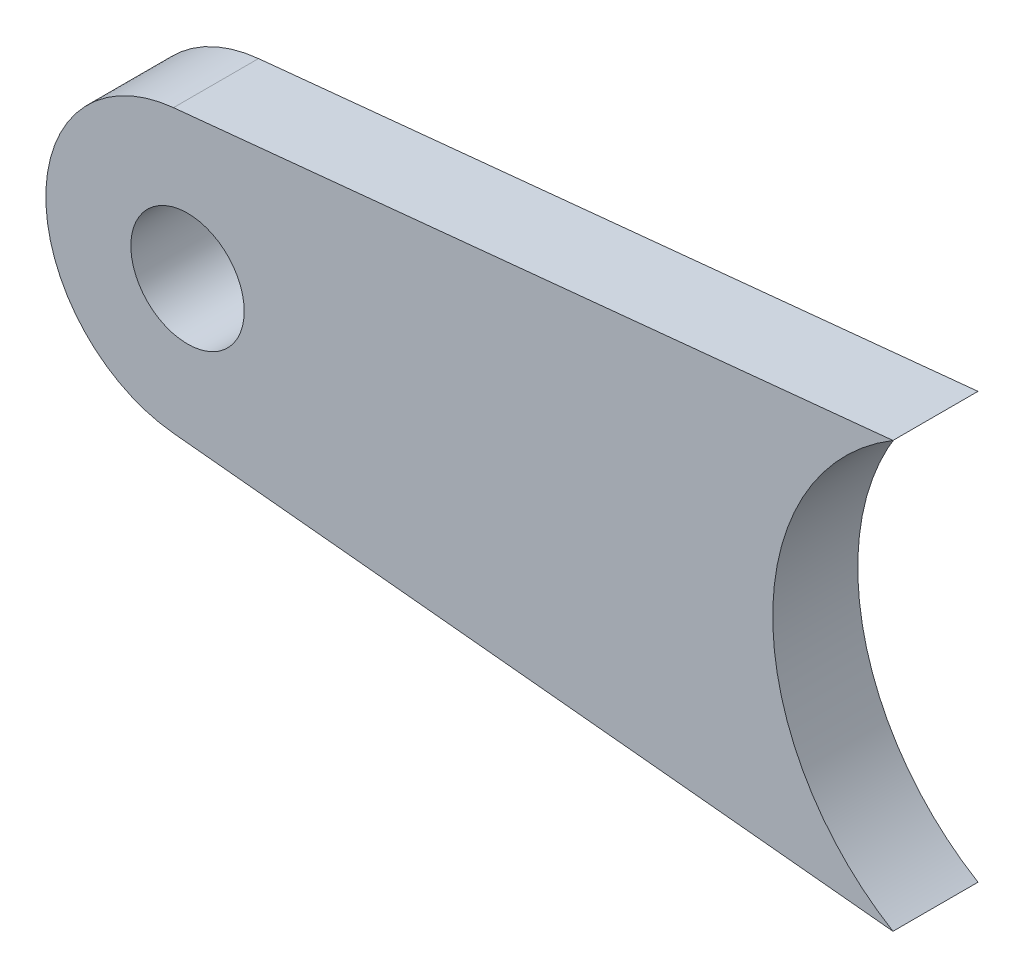
ISO-10303-21;
HEADER;
FILE_DESCRIPTION(('STEP AP214'),'2;1');
FILE_NAME('part.step','',(''),(''),'','','');
FILE_SCHEMA(('AUTOMOTIVE_DESIGN { 1 0 10303 214 1 1 1 1 }'));
ENDSEC;
DATA;
#1=APPLICATION_CONTEXT('core data for automotive mechanical design processes');
#2=APPLICATION_PROTOCOL_DEFINITION('international standard','automotive_design',2000,#1);
#3=PRODUCT_CONTEXT('',#1,'mechanical');
#4=PRODUCT('Part','Part','',(#3));
#5=PRODUCT_RELATED_PRODUCT_CATEGORY('part','',(#4));
#6=PRODUCT_DEFINITION_FORMATION('','',#4);
#7=PRODUCT_DEFINITION_CONTEXT('part definition',#1,'design');
#8=PRODUCT_DEFINITION('design','',#6,#7);
#9=PRODUCT_DEFINITION_SHAPE('','',#8);
#10=(LENGTH_UNIT() NAMED_UNIT(*) SI_UNIT(.MILLI.,.METRE.));
#11=(NAMED_UNIT(*) PLANE_ANGLE_UNIT() SI_UNIT($,.RADIAN.));
#12=(NAMED_UNIT(*) SI_UNIT($,.STERADIAN.) SOLID_ANGLE_UNIT());
#13=UNCERTAINTY_MEASURE_WITH_UNIT(LENGTH_MEASURE(1.E-05),#10,'distance_accuracy_value','');
#14=(GEOMETRIC_REPRESENTATION_CONTEXT(3) GLOBAL_UNCERTAINTY_ASSIGNED_CONTEXT((#13)) GLOBAL_UNIT_ASSIGNED_CONTEXT((#10,
#11,#12)) REPRESENTATION_CONTEXT('',''));
#15=CARTESIAN_POINT('',(0.,0.,0.));
#16=DIRECTION('',(0.,0.,1.));
#17=DIRECTION('',(1.,0.,0.));
#18=AXIS2_PLACEMENT_3D('',#15,#16,#17);
#19=CARTESIAN_POINT('',(77.815,0.,6.));
#20=DIRECTION('',(0.,0.,1.));
#21=DIRECTION('',(1.,0.,0.));
#22=AXIS2_PLACEMENT_3D('',#19,#20,#21);
#23=PLANE('',#22);
#24=CARTESIAN_POINT('',(77.815,0.,6.));
#25=DIRECTION('',(0.,0.,-1.));
#26=DIRECTION('',(1.,0.,0.));
#27=AXIS2_PLACEMENT_3D('',#24,#25,#26);
#28=CIRCLE('',#27,35.);
#29=CARTESIAN_POINT('',(59.78724362268,-30.,6.));
#30=VERTEX_POINT('',#29);
#31=CARTESIAN_POINT('',(59.78724362268,30.,6.));
#32=VERTEX_POINT('',#31);
#33=EDGE_CURVE('E87',#30,#32,#28,.T.);
#34=ORIENTED_EDGE('',*,*,#33,.T.);
#35=DIRECTION('',(-0.995092310823552,-0.0989509622987177,0.));
#36=VECTOR('',#35,1.);
#37=CARTESIAN_POINT('',(59.78724362268,30.,6.));
#38=LINE('',#37,#36);
#39=CARTESIAN_POINT('',(-41.7640192459744,19.9018462164711,6.));
#40=VERTEX_POINT('',#39);
#41=EDGE_CURVE('E82',#32,#40,#38,.T.);
#42=ORIENTED_EDGE('',*,*,#41,.T.);
#43=CARTESIAN_POINT('',(-39.785,0.,6.));
#44=DIRECTION('',(0.,0.,1.));
#45=DIRECTION('',(1.,0.,0.));
#46=AXIS2_PLACEMENT_3D('',#43,#44,#45);
#47=CIRCLE('',#46,20.);
#48=CARTESIAN_POINT('',(-41.7640192459744,-19.9018462164711,6.));
#49=VERTEX_POINT('',#48);
#50=EDGE_CURVE('E85',#40,#49,#47,.T.);
#51=ORIENTED_EDGE('',*,*,#50,.T.);
#52=DIRECTION('',(0.995092310823552,-0.0989509622987182,0.));
#53=VECTOR('',#52,1.);
#54=CARTESIAN_POINT('',(-41.7640192459744,-19.9018462164711,6.));
#55=LINE('',#54,#53);
#56=EDGE_CURVE('E52',#49,#30,#55,.T.);
#57=ORIENTED_EDGE('',*,*,#56,.T.);
#58=EDGE_LOOP('',(#34,#42,#51,#57));
#59=FACE_BOUND('',#58,.T.);
#60=CARTESIAN_POINT('',(-39.785,0.,6.));
#61=DIRECTION('',(0.,0.,1.));
#62=DIRECTION('',(1.,0.,0.));
#63=AXIS2_PLACEMENT_3D('',#60,#61,#62);
#64=CIRCLE('',#63,8.);
#65=CARTESIAN_POINT('',(-31.785,0.,6.));
#66=VERTEX_POINT('',#65);
#67=EDGE_CURVE('E102',#66,#66,#64,.T.);
#68=ORIENTED_EDGE('',*,*,#67,.F.);
#69=EDGE_LOOP('',(#68));
#70=FACE_BOUND('',#69,.T.);
#71=ADVANCED_FACE('F35',(#59,#70),#23,.T.);
#72=CARTESIAN_POINT('',(77.815,0.,-6.));
#73=DIRECTION('',(0.,0.,1.));
#74=DIRECTION('',(1.,0.,0.));
#75=AXIS2_PLACEMENT_3D('',#72,#73,#74);
#76=PLANE('',#75);
#77=CARTESIAN_POINT('',(77.815,0.,-6.));
#78=DIRECTION('',(0.,0.,-1.));
#79=DIRECTION('',(1.,0.,0.));
#80=AXIS2_PLACEMENT_3D('',#77,#78,#79);
#81=CIRCLE('',#80,35.);
#82=CARTESIAN_POINT('',(59.78724362268,-30.,-6.));
#83=VERTEX_POINT('',#82);
#84=CARTESIAN_POINT('',(59.78724362268,30.,-6.));
#85=VERTEX_POINT('',#84);
#86=EDGE_CURVE('E99',#83,#85,#81,.T.);
#87=ORIENTED_EDGE('',*,*,#86,.F.);
#88=DIRECTION('',(0.995092310823552,-0.0989509622987182,0.));
#89=VECTOR('',#88,1.);
#90=CARTESIAN_POINT('',(-41.7640192459744,-19.9018462164711,-6.));
#91=LINE('',#90,#89);
#92=CARTESIAN_POINT('',(-41.7640192459744,-19.9018462164711,-6.));
#93=VERTEX_POINT('',#92);
#94=EDGE_CURVE('E75',#93,#83,#91,.T.);
#95=ORIENTED_EDGE('',*,*,#94,.F.);
#96=CARTESIAN_POINT('',(-39.785,0.,-6.));
#97=DIRECTION('',(0.,0.,1.));
#98=DIRECTION('',(1.,0.,0.));
#99=AXIS2_PLACEMENT_3D('',#96,#97,#98);
#100=CIRCLE('',#99,20.);
#101=CARTESIAN_POINT('',(-41.7640192459744,19.9018462164711,-6.));
#102=VERTEX_POINT('',#101);
#103=EDGE_CURVE('E69',#102,#93,#100,.T.);
#104=ORIENTED_EDGE('',*,*,#103,.F.);
#105=DIRECTION('',(-0.995092310823552,-0.0989509622987177,0.));
#106=VECTOR('',#105,1.);
#107=CARTESIAN_POINT('',(59.78724362268,30.,-6.));
#108=LINE('',#107,#106);
#109=EDGE_CURVE('E91',#85,#102,#108,.T.);
#110=ORIENTED_EDGE('',*,*,#109,.F.);
#111=EDGE_LOOP('',(#87,#95,#104,#110));
#112=FACE_BOUND('',#111,.T.);
#113=CARTESIAN_POINT('',(-39.785,0.,-6.));
#114=DIRECTION('',(0.,0.,1.));
#115=DIRECTION('',(1.,0.,0.));
#116=AXIS2_PLACEMENT_3D('',#113,#114,#115);
#117=CIRCLE('',#116,8.);
#118=CARTESIAN_POINT('',(-31.785,0.,-6.));
#119=VERTEX_POINT('',#118);
#120=EDGE_CURVE('E114',#119,#119,#117,.T.);
#121=ORIENTED_EDGE('',*,*,#120,.T.);
#122=EDGE_LOOP('',(#121));
#123=FACE_BOUND('',#122,.T.);
#124=ADVANCED_FACE('F110',(#112,#123),#76,.F.);
#125=CARTESIAN_POINT('',(77.815,0.,6.));
#126=DIRECTION('',(0.,0.,-1.));
#127=DIRECTION('',(-1.,0.,0.));
#128=AXIS2_PLACEMENT_3D('',#125,#126,#127);
#129=CYLINDRICAL_SURFACE('',#128,35.);
#130=ORIENTED_EDGE('',*,*,#86,.T.);
#131=DIRECTION('',(0.,0.,-1.));
#132=VECTOR('',#131,1.);
#133=CARTESIAN_POINT('',(59.78724362268,30.,6.));
#134=LINE('',#133,#132);
#135=EDGE_CURVE('E11',#32,#85,#134,.T.);
#136=ORIENTED_EDGE('',*,*,#135,.F.);
#137=ORIENTED_EDGE('',*,*,#33,.F.);
#138=DIRECTION('',(0.,0.,-1.));
#139=VECTOR('',#138,1.);
#140=CARTESIAN_POINT('',(59.78724362268,-30.,6.));
#141=LINE('',#140,#139);
#142=EDGE_CURVE('E95',#30,#83,#141,.T.);
#143=ORIENTED_EDGE('',*,*,#142,.T.);
#144=EDGE_LOOP('',(#130,#136,#137,#143));
#145=FACE_BOUND('',#144,.T.);
#146=ADVANCED_FACE('F37',(#145),#129,.F.);
#147=CARTESIAN_POINT('',(59.78724362268,30.,6.));
#148=DIRECTION('',(0.0989509622987177,-0.995092310823553,0.));
#149=DIRECTION('',(0.995092310823553,0.0989509622987177,0.));
#150=AXIS2_PLACEMENT_3D('',#147,#148,#149);
#151=PLANE('',#150);
#152=ORIENTED_EDGE('',*,*,#109,.T.);
#153=DIRECTION('',(0.,0.,-1.));
#154=VECTOR('',#153,1.);
#155=CARTESIAN_POINT('',(-41.7640192459744,19.9018462164711,6.));
#156=LINE('',#155,#154);
#157=EDGE_CURVE('E44',#40,#102,#156,.T.);
#158=ORIENTED_EDGE('',*,*,#157,.F.);
#159=ORIENTED_EDGE('',*,*,#41,.F.);
#160=ORIENTED_EDGE('',*,*,#135,.T.);
#161=EDGE_LOOP('',(#152,#158,#159,#160));
#162=FACE_BOUND('',#161,.T.);
#163=ADVANCED_FACE('F90',(#162),#151,.F.);
#164=CARTESIAN_POINT('',(-39.785,0.,6.));
#165=DIRECTION('',(0.,0.,-1.));
#166=DIRECTION('',(-1.,0.,0.));
#167=AXIS2_PLACEMENT_3D('',#164,#165,#166);
#168=CYLINDRICAL_SURFACE('',#167,20.);
#169=ORIENTED_EDGE('',*,*,#103,.T.);
#170=DIRECTION('',(0.,0.,-1.));
#171=VECTOR('',#170,1.);
#172=CARTESIAN_POINT('',(-41.7640192459744,-19.9018462164711,6.));
#173=LINE('',#172,#171);
#174=EDGE_CURVE('E92',#49,#93,#173,.T.);
#175=ORIENTED_EDGE('',*,*,#174,.F.);
#176=ORIENTED_EDGE('',*,*,#50,.F.);
#177=ORIENTED_EDGE('',*,*,#157,.T.);
#178=EDGE_LOOP('',(#169,#175,#176,#177));
#179=FACE_BOUND('',#178,.T.);
#180=ADVANCED_FACE('F93',(#179),#168,.T.);
#181=CARTESIAN_POINT('',(-41.7640192459744,-19.9018462164711,6.));
#182=DIRECTION('',(0.0989509622987182,0.995092310823553,0.));
#183=DIRECTION('',(-0.995092310823553,0.0989509622987182,0.));
#184=AXIS2_PLACEMENT_3D('',#181,#182,#183);
#185=PLANE('',#184);
#186=ORIENTED_EDGE('',*,*,#94,.T.);
#187=ORIENTED_EDGE('',*,*,#142,.F.);
#188=ORIENTED_EDGE('',*,*,#56,.F.);
#189=ORIENTED_EDGE('',*,*,#174,.T.);
#190=EDGE_LOOP('',(#186,#187,#188,#189));
#191=FACE_BOUND('',#190,.T.);
#192=ADVANCED_FACE('F107',(#191),#185,.F.);
#193=CARTESIAN_POINT('',(-39.785,0.,6.));
#194=DIRECTION('',(0.,0.,-1.));
#195=DIRECTION('',(-1.,0.,0.));
#196=AXIS2_PLACEMENT_3D('',#193,#194,#195);
#197=CYLINDRICAL_SURFACE('',#196,8.);
#198=ORIENTED_EDGE('',*,*,#67,.T.);
#199=EDGE_LOOP('',(#198));
#200=FACE_BOUND('',#199,.T.);
#201=ORIENTED_EDGE('',*,*,#120,.F.);
#202=EDGE_LOOP('',(#201));
#203=FACE_BOUND('',#202,.T.);
#204=ADVANCED_FACE('F120',(#200,#203),#197,.F.);
#205=CLOSED_SHELL('',(#71,#124,#146,#163,#180,#192,#204));
#206=MANIFOLD_SOLID_BREP('B2',#205);
#207=ADVANCED_BREP_SHAPE_REPRESENTATION('',(#18,#206),#14);
#208=SHAPE_DEFINITION_REPRESENTATION(#9,#207);
ENDSEC;
END-ISO-10303-21;
